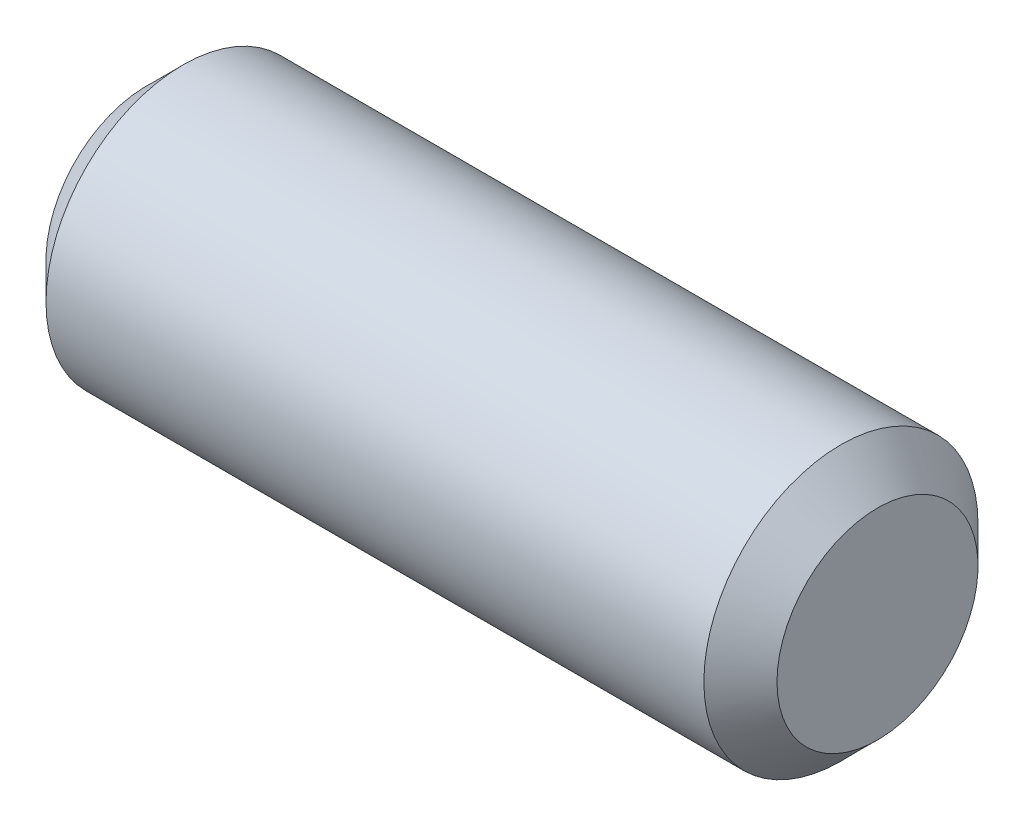
ISO-10303-21;
HEADER;
FILE_DESCRIPTION(('STEP AP214'),'2;1');
FILE_NAME('part.step','',(''),(''),'','','');
FILE_SCHEMA(('AUTOMOTIVE_DESIGN { 1 0 10303 214 1 1 1 1 }'));
ENDSEC;
DATA;
#1=APPLICATION_CONTEXT('core data for automotive mechanical design processes');
#2=APPLICATION_PROTOCOL_DEFINITION('international standard','automotive_design',2000,#1);
#3=PRODUCT_CONTEXT('',#1,'mechanical');
#4=PRODUCT('Part','Part','',(#3));
#5=PRODUCT_RELATED_PRODUCT_CATEGORY('part','',(#4));
#6=PRODUCT_DEFINITION_FORMATION('','',#4);
#7=PRODUCT_DEFINITION_CONTEXT('part definition',#1,'design');
#8=PRODUCT_DEFINITION('design','',#6,#7);
#9=PRODUCT_DEFINITION_SHAPE('','',#8);
#10=(LENGTH_UNIT() NAMED_UNIT(*) SI_UNIT(.MILLI.,.METRE.));
#11=(NAMED_UNIT(*) PLANE_ANGLE_UNIT() SI_UNIT($,.RADIAN.));
#12=(NAMED_UNIT(*) SI_UNIT($,.STERADIAN.) SOLID_ANGLE_UNIT());
#13=UNCERTAINTY_MEASURE_WITH_UNIT(LENGTH_MEASURE(1.E-05),#10,'distance_accuracy_value','');
#14=(GEOMETRIC_REPRESENTATION_CONTEXT(3) GLOBAL_UNCERTAINTY_ASSIGNED_CONTEXT((#13)) GLOBAL_UNIT_ASSIGNED_CONTEXT((#10,
#11,#12)) REPRESENTATION_CONTEXT('',''));
#15=CARTESIAN_POINT('',(0.,0.,0.));
#16=DIRECTION('',(0.,0.,1.));
#17=DIRECTION('',(1.,0.,0.));
#18=AXIS2_PLACEMENT_3D('',#15,#16,#17);
#19=CARTESIAN_POINT('',(-5.34269662921348,0.,0.));
#20=DIRECTION('',(1.,0.,0.));
#21=DIRECTION('',(0.,0.,-1.));
#22=AXIS2_PLACEMENT_3D('',#19,#20,#21);
#23=PLANE('',#22);
#24=CARTESIAN_POINT('',(-5.34269662921348,0.,0.));
#25=DIRECTION('',(1.,0.,0.));
#26=DIRECTION('',(0.,0.,-1.));
#27=AXIS2_PLACEMENT_3D('',#24,#25,#26);
#28=CIRCLE('',#27,2.2);
#29=CARTESIAN_POINT('',(-5.34269662921348,0.,-2.2));
#30=VERTEX_POINT('',#29);
#31=EDGE_CURVE('E48',#30,#30,#28,.F.);
#32=ORIENTED_EDGE('',*,*,#31,.T.);
#33=EDGE_LOOP('',(#32));
#34=FACE_BOUND('',#33,.T.);
#35=ADVANCED_FACE('F33',(#34),#23,.F.);
#36=CARTESIAN_POINT('',(-6.32022471910112,0.,0.));
#37=DIRECTION('',(-1.,0.,0.));
#38=DIRECTION('',(0.,0.,1.));
#39=AXIS2_PLACEMENT_3D('',#36,#37,#38);
#40=CYLINDRICAL_SURFACE('',#39,3.);
#41=CARTESIAN_POINT('',(-4.54269662921348,0.,0.));
#42=DIRECTION('',(1.,0.,0.));
#43=DIRECTION('',(0.,0.,-1.));
#44=AXIS2_PLACEMENT_3D('',#41,#42,#43);
#45=CIRCLE('',#44,3.);
#46=CARTESIAN_POINT('',(-4.54269662921348,0.,-3.));
#47=VERTEX_POINT('',#46);
#48=EDGE_CURVE('E40',#47,#47,#45,.T.);
#49=ORIENTED_EDGE('',*,*,#48,.T.);
#50=EDGE_LOOP('',(#49));
#51=FACE_BOUND('',#50,.T.);
#52=CARTESIAN_POINT('',(9.85730337078653,0.,0.));
#53=DIRECTION('',(-1.,0.,0.));
#54=DIRECTION('',(0.,0.,1.));
#55=AXIS2_PLACEMENT_3D('',#52,#53,#54);
#56=CIRCLE('',#55,3.);
#57=CARTESIAN_POINT('',(9.85730337078653,0.,3.));
#58=VERTEX_POINT('',#57);
#59=EDGE_CURVE('E44',#58,#58,#56,.T.);
#60=ORIENTED_EDGE('',*,*,#59,.T.);
#61=EDGE_LOOP('',(#60));
#62=FACE_BOUND('',#61,.T.);
#63=ADVANCED_FACE('F64',(#51,#62),#40,.T.);
#64=CARTESIAN_POINT('',(10.6573033707865,3.,0.));
#65=DIRECTION('',(-1.,0.,0.));
#66=DIRECTION('',(0.,0.,1.));
#67=AXIS2_PLACEMENT_3D('',#64,#65,#66);
#68=PLANE('',#67);
#69=CARTESIAN_POINT('',(10.6573033707865,0.,0.));
#70=DIRECTION('',(-1.,0.,0.));
#71=DIRECTION('',(0.,0.,1.));
#72=AXIS2_PLACEMENT_3D('',#69,#70,#71);
#73=CIRCLE('',#72,2.2);
#74=CARTESIAN_POINT('',(10.6573033707865,0.,2.2));
#75=VERTEX_POINT('',#74);
#76=EDGE_CURVE('E10',#75,#75,#73,.F.);
#77=ORIENTED_EDGE('',*,*,#76,.T.);
#78=EDGE_LOOP('',(#77));
#79=FACE_BOUND('',#78,.T.);
#80=ADVANCED_FACE('F57',(#79),#68,.F.);
#81=CARTESIAN_POINT('',(-5.34269662921348,0.,0.));
#82=DIRECTION('',(1.,0.,0.));
#83=DIRECTION('',(0.,0.,-1.));
#84=AXIS2_PLACEMENT_3D('',#81,#82,#83);
#85=CONICAL_SURFACE('',#84,2.2,0.785398163397446);
#86=ORIENTED_EDGE('',*,*,#48,.F.);
#87=EDGE_LOOP('',(#86));
#88=FACE_BOUND('',#87,.T.);
#89=ORIENTED_EDGE('',*,*,#31,.F.);
#90=EDGE_LOOP('',(#89));
#91=FACE_BOUND('',#90,.T.);
#92=ADVANCED_FACE('F55',(#88,#91),#85,.T.);
#93=CARTESIAN_POINT('',(9.85730337078653,0.,0.));
#94=DIRECTION('',(-1.,0.,0.));
#95=DIRECTION('',(0.,0.,1.));
#96=AXIS2_PLACEMENT_3D('',#93,#94,#95);
#97=CONICAL_SURFACE('',#96,3.,0.785398163397452);
#98=ORIENTED_EDGE('',*,*,#76,.F.);
#99=EDGE_LOOP('',(#98));
#100=FACE_BOUND('',#99,.T.);
#101=ORIENTED_EDGE('',*,*,#59,.F.);
#102=EDGE_LOOP('',(#101));
#103=FACE_BOUND('',#102,.T.);
#104=ADVANCED_FACE('F35',(#100,#103),#97,.T.);
#105=CLOSED_SHELL('',(#35,#63,#80,#92,#104));
#106=MANIFOLD_SOLID_BREP('B2',#105);
#107=ADVANCED_BREP_SHAPE_REPRESENTATION('',(#18,#106),#14);
#108=SHAPE_DEFINITION_REPRESENTATION(#9,#107);
ENDSEC;
END-ISO-10303-21;
